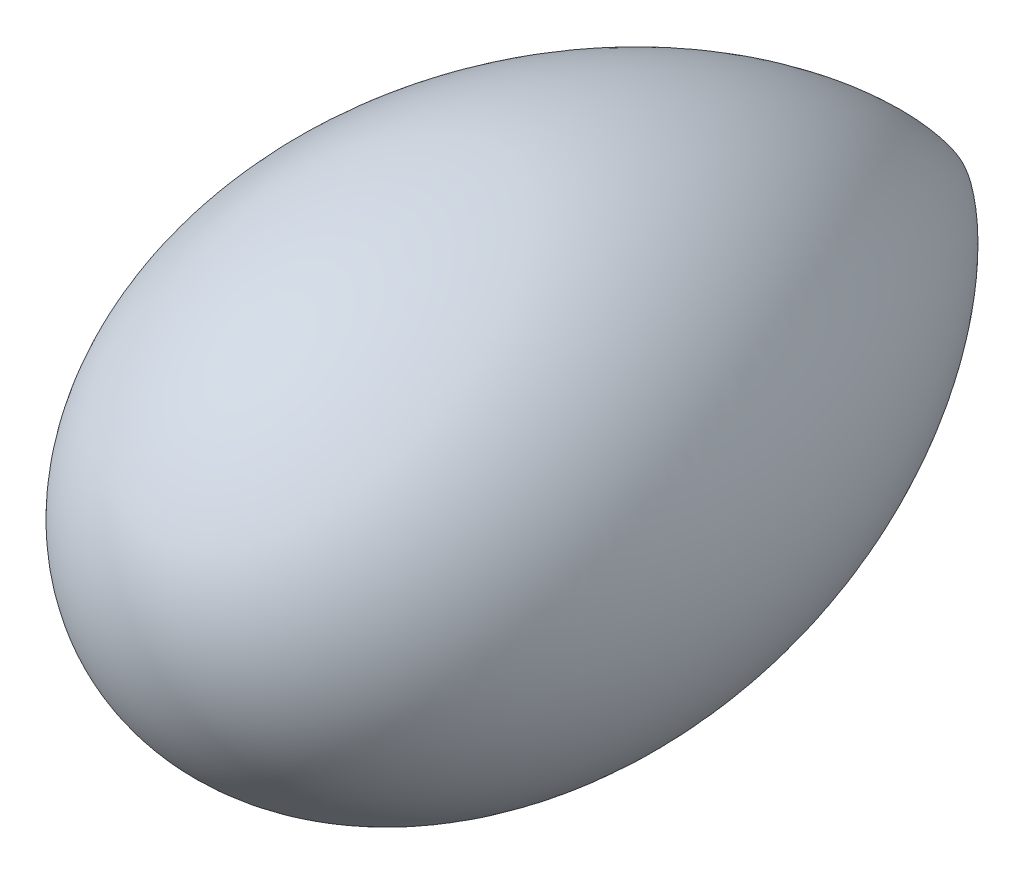
ISO-10303-21;
HEADER;
FILE_DESCRIPTION(('STEP AP214'),'2;1');
FILE_NAME('part.step','',(''),(''),'','','');
FILE_SCHEMA(('AUTOMOTIVE_DESIGN { 1 0 10303 214 1 1 1 1 }'));
ENDSEC;
DATA;
#1=APPLICATION_CONTEXT('core data for automotive mechanical design processes');
#2=APPLICATION_PROTOCOL_DEFINITION('international standard','automotive_design',2000,#1);
#3=PRODUCT_CONTEXT('',#1,'mechanical');
#4=PRODUCT('Part','Part','',(#3));
#5=PRODUCT_RELATED_PRODUCT_CATEGORY('part','',(#4));
#6=PRODUCT_DEFINITION_FORMATION('','',#4);
#7=PRODUCT_DEFINITION_CONTEXT('part definition',#1,'design');
#8=PRODUCT_DEFINITION('design','',#6,#7);
#9=PRODUCT_DEFINITION_SHAPE('','',#8);
#10=(LENGTH_UNIT() NAMED_UNIT(*) SI_UNIT(.MILLI.,.METRE.));
#11=(NAMED_UNIT(*) PLANE_ANGLE_UNIT() SI_UNIT($,.RADIAN.));
#12=(NAMED_UNIT(*) SI_UNIT($,.STERADIAN.) SOLID_ANGLE_UNIT());
#13=UNCERTAINTY_MEASURE_WITH_UNIT(LENGTH_MEASURE(1.E-05),#10,'distance_accuracy_value','');
#14=(GEOMETRIC_REPRESENTATION_CONTEXT(3) GLOBAL_UNCERTAINTY_ASSIGNED_CONTEXT((#13)) GLOBAL_UNIT_ASSIGNED_CONTEXT((#10,
#11,#12)) REPRESENTATION_CONTEXT('',''));
#15=CARTESIAN_POINT('',(0.,0.,0.));
#16=DIRECTION('',(0.,0.,1.));
#17=DIRECTION('',(1.,0.,0.));
#18=AXIS2_PLACEMENT_3D('',#15,#16,#17);
#19=CARTESIAN_POINT('',(1.00984741772513E-10,0.,55.7313000682652));
#20=CARTESIAN_POINT('',(0.0598318977912095,0.,55.7313000682628));
#21=CARTESIAN_POINT('',(0.179562729850037,0.,55.7304033513174));
#22=CARTESIAN_POINT('',(0.390928619589884,0.,55.7263681246508));
#23=CARTESIAN_POINT('',(0.656586719955676,0.,55.7156124664117));
#24=CARTESIAN_POINT('',(0.979392234694838,0.,55.695461034759));
#25=CARTESIAN_POINT('',(1.37168870196537,0.,55.6605778212019));
#26=CARTESIAN_POINT('',(1.76090118830921,0.,55.6123911231636));
#27=CARTESIAN_POINT('',(2.1487141101874,0.,55.5510455909982));
#28=CARTESIAN_POINT('',(2.53458864983901,0.,55.4792862304096));
#29=CARTESIAN_POINT('',(3.17436716373972,0.,55.3424704848318));
#30=CARTESIAN_POINT('',(4.12094692249202,0.,55.0799098799436));
#31=CARTESIAN_POINT('',(5.22462288092568,0.,54.6623415449157));
#32=CARTESIAN_POINT('',(6.39794578523505,0.,54.0796114542573));
#33=CARTESIAN_POINT('',(7.40641288489174,0.,53.470028485142));
#34=CARTESIAN_POINT('',(8.26387846248891,0.,52.8685559155431));
#35=CARTESIAN_POINT('',(9.08039031837366,0.,52.212670056816));
#36=CARTESIAN_POINT('',(9.85458290218826,0.,51.507423809147));
#37=CARTESIAN_POINT('',(10.7683992404514,0.,50.5701852688207));
#38=CARTESIAN_POINT('',(11.7779347981884,0.,49.3654527936855));
#39=CARTESIAN_POINT('',(12.7394186187354,0.,47.9894390705127));
#40=CARTESIAN_POINT('',(13.6311429091898,0.,46.444788513182));
#41=CARTESIAN_POINT('',(14.4101885651969,0.,44.8411287778817));
#42=CARTESIAN_POINT('',(15.0797479259612,0.,43.1883973849634));
#43=CARTESIAN_POINT('',(15.840993952421,0.,40.8457985913771));
#44=CARTESIAN_POINT('',(16.5178593305107,0.,37.7735062069002));
#45=CARTESIAN_POINT('',(16.9086340537515,0.,34.1217026792124));
#46=CARTESIAN_POINT('',(16.8565569894151,0.,29.9265448193152));
#47=CARTESIAN_POINT('',(16.3459886524434,0.,25.7634454358936));
#48=CARTESIAN_POINT('',(15.4095986375016,0.,21.6757938243882));
#49=CARTESIAN_POINT('',(14.073424109556,0.,17.701228914189));
#50=CARTESIAN_POINT('',(12.3574352467384,0.,13.8754153863226));
#51=CARTESIAN_POINT('',(10.2758005841187,0.,10.2352499619775));
#52=CARTESIAN_POINT('',(8.14093285219377,0.,7.25037699240603));
#53=CARTESIAN_POINT('',(6.0862695429647,0.,4.87052336472312));
#54=CARTESIAN_POINT('',(4.35575110122056,0.,3.17122470375119));
#55=CARTESIAN_POINT('',(3.06590454070134,0.,2.05080314217934));
#56=CARTESIAN_POINT('',(1.97446622926107,0.,1.21508249233629));
#57=CARTESIAN_POINT('',(1.19371296132129,0.,0.680668395579309));
#58=CARTESIAN_POINT('',(0.587508960825163,0.,0.310465880759765));
#59=CARTESIAN_POINT('',(0.255429091765937,0.,0.125951121733345));
#60=CARTESIAN_POINT('',(0.0857836904652062,0.,0.0407232603094361));
#61=CARTESIAN_POINT('',(0.,0.,0.));
#62=B_SPLINE_CURVE_WITH_KNOTS('',4,(#19,#20,#21,#22,#23,#24,#25,#26,#27,#28,#29,#30,#31,#32,#33,
#34,#35,#36,#37,#38,#39,#40,#41,#42,#43,#44,#45,#46,#47,#48,#49,#50,#51,#52,#53,#54,#55,#56,#57,
#58,#59,#60,#61),.UNSPECIFIED.,.F.,.F.,(5,1,1,1,1,1,1,1,1,1,1,1,1,1,1,1,1,1,1,1,1,1,1,1,1,1,1,1,
1,1,1,1,1,1,1,1,1,1,1,5),(0.0853246715427618,0.0887485509040368,0.0921724302653117,
0.0955963096265867,0.0990201889878616,0.105867947710412,0.112715706432961,0.116139589732041,
0.119563473031121,0.12641123962928,0.14695454522692,0.167497862430884,0.181193345776511,
0.194888829122138,0.208584415628072,0.222280002134007,0.235975530838741,0.249671059543476,
0.277062180815685,0.304453170294509,0.323693004216435,0.342932838138361,0.370323926496127,
0.397715014853894,0.45249719417462,0.507279373703119,0.562061567924162,0.616843748917064,
0.67162593046471,0.726408051134821,0.781190345492604,0.835972549580629,0.8907546682956,
0.918145813941736,0.945536959587871,0.962830449785445,0.980123939983018,0.990061969991509,
0.995030984995754,1.),.UNSPECIFIED.);
#63=CARTESIAN_POINT('',(0.,0.,0.));
#64=DIRECTION('',(0.,0.,-1.));
#65=AXIS1_PLACEMENT('',#63,#64);
#66=SURFACE_OF_REVOLUTION('',#62,#65);
#67=CARTESIAN_POINT('',(0.,0.,0.));
#68=VERTEX_POINT('',#67);
#69=VERTEX_LOOP('',#68);
#70=FACE_BOUND('',#69,.T.);
#71=CARTESIAN_POINT('',(0.,0.,55.7313000682652));
#72=VERTEX_POINT('',#71);
#73=VERTEX_LOOP('',#72);
#74=FACE_BOUND('',#73,.T.);
#75=ADVANCED_FACE('F40',(#70,#74),#66,.T.);
#76=CLOSED_SHELL('',(#75));
#77=MANIFOLD_SOLID_BREP('B2',#76);
#78=ADVANCED_BREP_SHAPE_REPRESENTATION('',(#18,#77),#14);
#79=SHAPE_DEFINITION_REPRESENTATION(#9,#78);
ENDSEC;
END-ISO-10303-21;
